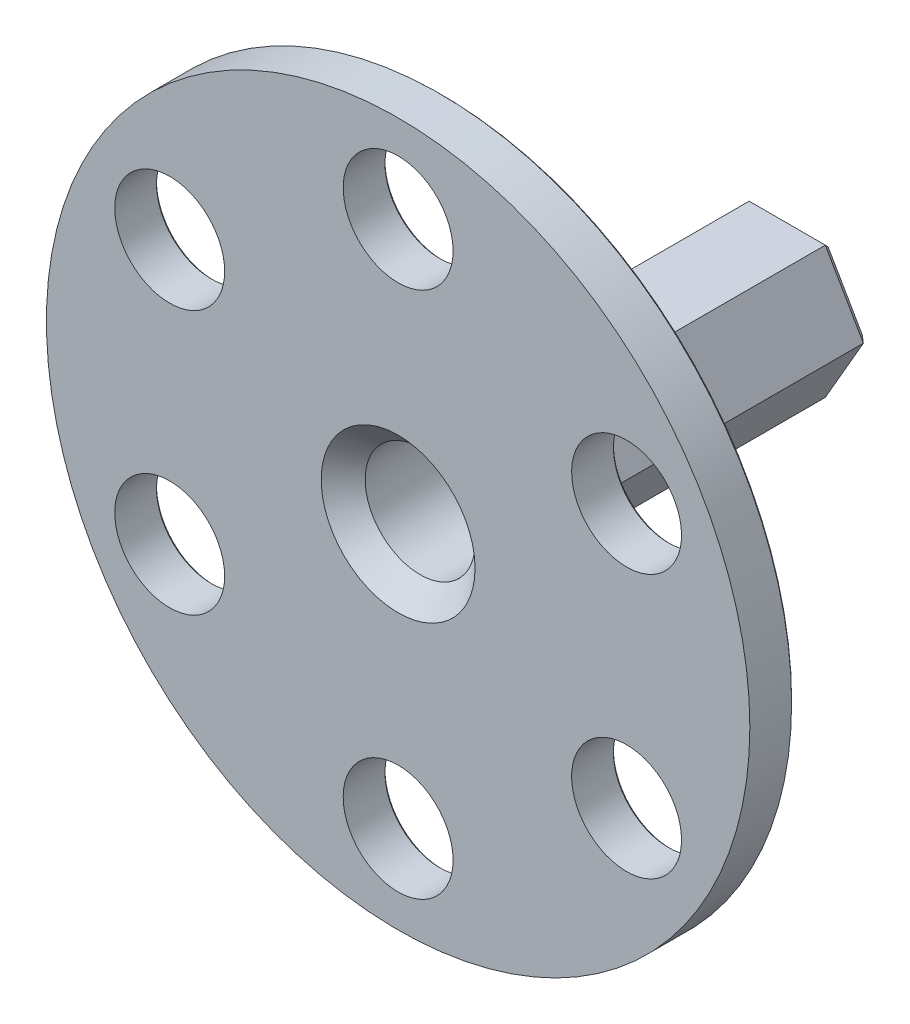
ISO-10303-21;
HEADER;
FILE_DESCRIPTION(('STEP AP214'),'2;1');
FILE_NAME('part.step','',(''),(''),'','','');
FILE_SCHEMA(('AUTOMOTIVE_DESIGN { 1 0 10303 214 1 1 1 1 }'));
ENDSEC;
DATA;
#1=APPLICATION_CONTEXT('core data for automotive mechanical design processes');
#2=APPLICATION_PROTOCOL_DEFINITION('international standard','automotive_design',2000,#1);
#3=PRODUCT_CONTEXT('',#1,'mechanical');
#4=PRODUCT('Part','Part','',(#3));
#5=PRODUCT_RELATED_PRODUCT_CATEGORY('part','',(#4));
#6=PRODUCT_DEFINITION_FORMATION('','',#4);
#7=PRODUCT_DEFINITION_CONTEXT('part definition',#1,'design');
#8=PRODUCT_DEFINITION('design','',#6,#7);
#9=PRODUCT_DEFINITION_SHAPE('','',#8);
#10=(LENGTH_UNIT() NAMED_UNIT(*) SI_UNIT(.MILLI.,.METRE.));
#11=(NAMED_UNIT(*) PLANE_ANGLE_UNIT() SI_UNIT($,.RADIAN.));
#12=(NAMED_UNIT(*) SI_UNIT($,.STERADIAN.) SOLID_ANGLE_UNIT());
#13=UNCERTAINTY_MEASURE_WITH_UNIT(LENGTH_MEASURE(1.E-05),#10,'distance_accuracy_value','');
#14=(GEOMETRIC_REPRESENTATION_CONTEXT(3) GLOBAL_UNCERTAINTY_ASSIGNED_CONTEXT((#13)) GLOBAL_UNIT_ASSIGNED_CONTEXT((#10,
#11,#12)) REPRESENTATION_CONTEXT('',''));
#15=CARTESIAN_POINT('',(0.,0.,0.));
#16=DIRECTION('',(0.,0.,1.));
#17=DIRECTION('',(1.,0.,0.));
#18=AXIS2_PLACEMENT_3D('',#15,#16,#17);
#19=CARTESIAN_POINT('',(0.,0.,-4.87838365161184));
#20=DIRECTION('',(0.,0.,1.));
#21=DIRECTION('',(1.,0.,0.));
#22=AXIS2_PLACEMENT_3D('',#19,#20,#21);
#23=PLANE('',#22);
#24=CARTESIAN_POINT('',(0.,-9.6,-4.87838365161184));
#25=DIRECTION('',(0.,0.,1.));
#26=DIRECTION('',(1.,0.,0.));
#27=AXIS2_PLACEMENT_3D('',#24,#25,#26);
#28=CIRCLE('',#27,2.08);
#29=CARTESIAN_POINT('',(2.08,-9.6,-4.87838365161184));
#30=VERTEX_POINT('',#29);
#31=EDGE_CURVE('E357',#30,#30,#28,.T.);
#32=ORIENTED_EDGE('',*,*,#31,.T.);
#33=EDGE_LOOP('',(#32));
#34=FACE_BOUND('',#33,.T.);
#35=CARTESIAN_POINT('',(8.31384387633059,-4.80000000000004,-4.87838365161184));
#36=DIRECTION('',(0.,0.,1.));
#37=DIRECTION('',(1.,0.,0.));
#38=AXIS2_PLACEMENT_3D('',#35,#36,#37);
#39=CIRCLE('',#38,2.08);
#40=CARTESIAN_POINT('',(10.3938438763306,-4.80000000000004,-4.87838365161184));
#41=VERTEX_POINT('',#40);
#42=EDGE_CURVE('E353',#41,#41,#39,.T.);
#43=ORIENTED_EDGE('',*,*,#42,.T.);
#44=EDGE_LOOP('',(#43));
#45=FACE_BOUND('',#44,.T.);
#46=CARTESIAN_POINT('',(8.31384387633062,4.79999999999998,-4.87838365161184));
#47=DIRECTION('',(0.,0.,1.));
#48=DIRECTION('',(1.,0.,0.));
#49=AXIS2_PLACEMENT_3D('',#46,#47,#48);
#50=CIRCLE('',#49,2.08);
#51=CARTESIAN_POINT('',(10.3938438763306,4.79999999999998,-4.87838365161184));
#52=VERTEX_POINT('',#51);
#53=EDGE_CURVE('E349',#52,#52,#50,.T.);
#54=ORIENTED_EDGE('',*,*,#53,.T.);
#55=EDGE_LOOP('',(#54));
#56=FACE_BOUND('',#55,.T.);
#57=CARTESIAN_POINT('',(0.,9.6,-4.87838365161184));
#58=DIRECTION('',(0.,0.,1.));
#59=DIRECTION('',(1.,0.,0.));
#60=AXIS2_PLACEMENT_3D('',#57,#58,#59);
#61=CIRCLE('',#60,2.08);
#62=CARTESIAN_POINT('',(2.08,9.6,-4.87838365161184));
#63=VERTEX_POINT('',#62);
#64=EDGE_CURVE('E345',#63,#63,#61,.T.);
#65=ORIENTED_EDGE('',*,*,#64,.T.);
#66=EDGE_LOOP('',(#65));
#67=FACE_BOUND('',#66,.T.);
#68=CARTESIAN_POINT('',(-8.31384387633056,4.80000000000009,-4.87838365161184));
#69=DIRECTION('',(0.,0.,1.));
#70=DIRECTION('',(1.,0.,0.));
#71=AXIS2_PLACEMENT_3D('',#68,#69,#70);
#72=CIRCLE('',#71,2.08000000000001);
#73=CARTESIAN_POINT('',(-6.23384387633055,4.80000000000009,-4.87838365161184));
#74=VERTEX_POINT('',#73);
#75=EDGE_CURVE('E341',#74,#74,#72,.T.);
#76=ORIENTED_EDGE('',*,*,#75,.T.);
#77=EDGE_LOOP('',(#76));
#78=FACE_BOUND('',#77,.T.);
#79=CARTESIAN_POINT('',(-8.31384387633065,-4.79999999999993,-4.87838365161184));
#80=DIRECTION('',(0.,0.,1.));
#81=DIRECTION('',(1.,0.,0.));
#82=AXIS2_PLACEMENT_3D('',#79,#80,#81);
#83=CIRCLE('',#82,2.08000000000001);
#84=CARTESIAN_POINT('',(-6.23384387633065,-4.79999999999993,-4.87838365161184));
#85=VERTEX_POINT('',#84);
#86=EDGE_CURVE('E337',#85,#85,#83,.T.);
#87=ORIENTED_EDGE('',*,*,#86,.T.);
#88=EDGE_LOOP('',(#87));
#89=FACE_BOUND('',#88,.T.);
#90=CARTESIAN_POINT('',(0.,0.,-4.87838365161184));
#91=DIRECTION('',(0.,0.,1.));
#92=DIRECTION('',(1.,0.,0.));
#93=AXIS2_PLACEMENT_3D('',#90,#91,#92);
#94=CIRCLE('',#93,12.72);
#95=CARTESIAN_POINT('',(12.72,0.,-4.87838365161184));
#96=VERTEX_POINT('',#95);
#97=EDGE_CURVE('E333',#96,#96,#94,.F.);
#98=ORIENTED_EDGE('',*,*,#97,.T.);
#99=EDGE_LOOP('',(#98));
#100=FACE_BOUND('',#99,.T.);
#101=DIRECTION('',(0.5,0.866025403784439,0.));
#102=VECTOR('',#101,1.);
#103=CARTESIAN_POINT('',(3.46410161513775,-0.399999999999999,-4.87838365161184));
#104=LINE('',#103,#102);
#105=CARTESIAN_POINT('',(1.8475208614068,-3.2,-4.87838365161184));
#106=VERTEX_POINT('',#105);
#107=CARTESIAN_POINT('',(3.6950417228136,0.,-4.87838365161184));
#108=VERTEX_POINT('',#107);
#109=EDGE_CURVE('E480',#106,#108,#104,.T.);
#110=ORIENTED_EDGE('',*,*,#109,.T.);
#111=DIRECTION('',(-0.5,0.866025403784439,0.));
#112=VECTOR('',#111,1.);
#113=CARTESIAN_POINT('',(2.07846096908265,2.8,-4.87838365161184));
#114=LINE('',#113,#112);
#115=CARTESIAN_POINT('',(1.8475208614068,3.19999999999999,-4.87838365161184));
#116=VERTEX_POINT('',#115);
#117=EDGE_CURVE('E483',#108,#116,#114,.T.);
#118=ORIENTED_EDGE('',*,*,#117,.T.);
#119=DIRECTION('',(-1.,0.,0.));
#120=VECTOR('',#119,1.);
#121=CARTESIAN_POINT('',(-1.3856406460551,3.19999999999999,-4.87838365161184));
#122=LINE('',#121,#120);
#123=CARTESIAN_POINT('',(-1.8475208614068,3.19999999999999,-4.87838365161184));
#124=VERTEX_POINT('',#123);
#125=EDGE_CURVE('E468',#116,#124,#122,.T.);
#126=ORIENTED_EDGE('',*,*,#125,.T.);
#127=DIRECTION('',(-0.5,-0.866025403784439,0.));
#128=VECTOR('',#127,1.);
#129=CARTESIAN_POINT('',(-3.46410161513775,0.399999999999996,-4.87838365161184));
#130=LINE('',#129,#128);
#131=CARTESIAN_POINT('',(-3.6950417228136,0.,-4.87838365161184));
#132=VERTEX_POINT('',#131);
#133=EDGE_CURVE('E471',#124,#132,#130,.T.);
#134=ORIENTED_EDGE('',*,*,#133,.T.);
#135=DIRECTION('',(0.5,-0.866025403784439,0.));
#136=VECTOR('',#135,1.);
#137=CARTESIAN_POINT('',(-2.07846096908265,-2.8,-4.87838365161184));
#138=LINE('',#137,#136);
#139=CARTESIAN_POINT('',(-1.8475208614068,-3.2,-4.87838365161184));
#140=VERTEX_POINT('',#139);
#141=EDGE_CURVE('E474',#132,#140,#138,.T.);
#142=ORIENTED_EDGE('',*,*,#141,.T.);
#143=DIRECTION('',(1.,0.,0.));
#144=VECTOR('',#143,1.);
#145=CARTESIAN_POINT('',(1.38564064605511,-3.2,-4.87838365161184));
#146=LINE('',#145,#144);
#147=EDGE_CURVE('E477',#140,#106,#146,.T.);
#148=ORIENTED_EDGE('',*,*,#147,.T.);
#149=EDGE_LOOP('',(#110,#118,#126,#134,#142,#148));
#150=FACE_BOUND('',#149,.T.);
#151=ADVANCED_FACE('F50',(#34,#45,#56,#67,#78,#89,#100,#150),#23,.F.);
#152=CARTESIAN_POINT('',(0.,0.,-4.87838365161184));
#153=DIRECTION('',(0.,0.,1.));
#154=DIRECTION('',(1.,0.,0.));
#155=AXIS2_PLACEMENT_3D('',#152,#153,#154);
#156=CYLINDRICAL_SURFACE('',#155,12.8);
#157=CARTESIAN_POINT('',(0.,0.,-4.79838365161185));
#158=DIRECTION('',(0.,0.,1.));
#159=DIRECTION('',(1.,0.,0.));
#160=AXIS2_PLACEMENT_3D('',#157,#158,#159);
#161=CIRCLE('',#160,12.8);
#162=CARTESIAN_POINT('',(12.8,0.,-4.79838365161185));
#163=VERTEX_POINT('',#162);
#164=EDGE_CURVE('E384',#163,#163,#161,.T.);
#165=ORIENTED_EDGE('',*,*,#164,.T.);
#166=EDGE_LOOP('',(#165));
#167=FACE_BOUND('',#166,.T.);
#168=CARTESIAN_POINT('',(0.,0.,-3.27838365161185));
#169=DIRECTION('',(0.,0.,1.));
#170=DIRECTION('',(1.,0.,0.));
#171=AXIS2_PLACEMENT_3D('',#168,#169,#170);
#172=CIRCLE('',#171,12.8);
#173=CARTESIAN_POINT('',(12.8,0.,-3.27838365161185));
#174=VERTEX_POINT('',#173);
#175=EDGE_CURVE('E460',#174,#174,#172,.T.);
#176=ORIENTED_EDGE('',*,*,#175,.F.);
#177=EDGE_LOOP('',(#176));
#178=FACE_BOUND('',#177,.T.);
#179=ADVANCED_FACE('F157',(#167,#178),#156,.T.);
#180=CARTESIAN_POINT('',(0.,0.,-3.27838365161185));
#181=DIRECTION('',(0.,0.,1.));
#182=DIRECTION('',(1.,0.,0.));
#183=AXIS2_PLACEMENT_3D('',#180,#181,#182);
#184=PLANE('',#183);
#185=CARTESIAN_POINT('',(0.,0.,-3.27838365161185));
#186=DIRECTION('',(0.,0.,1.));
#187=DIRECTION('',(1.,0.,0.));
#188=AXIS2_PLACEMENT_3D('',#185,#186,#187);
#189=CIRCLE('',#188,2.80000000000001);
#190=CARTESIAN_POINT('',(2.80000000000002,0.,-3.27838365161185));
#191=VERTEX_POINT('',#190);
#192=EDGE_CURVE('E11',#191,#191,#189,.F.);
#193=ORIENTED_EDGE('',*,*,#192,.T.);
#194=EDGE_LOOP('',(#193));
#195=FACE_BOUND('',#194,.T.);
#196=CARTESIAN_POINT('',(-8.31384387633056,4.80000000000009,-3.27838365161185));
#197=DIRECTION('',(0.,0.,1.));
#198=DIRECTION('',(0.50000000000001,0.866025403784433,0.));
#199=AXIS2_PLACEMENT_3D('',#196,#197,#198);
#200=CIRCLE('',#199,2.);
#201=CARTESIAN_POINT('',(-7.31384387633053,6.53205080756896,-3.27838365161185));
#202=VERTEX_POINT('',#201);
#203=EDGE_CURVE('E436',#202,#202,#200,.T.);
#204=ORIENTED_EDGE('',*,*,#203,.F.);
#205=EDGE_LOOP('',(#204));
#206=FACE_BOUND('',#205,.T.);
#207=CARTESIAN_POINT('',(-8.31384387633065,-4.79999999999993,-3.27838365161185));
#208=DIRECTION('',(0.,0.,1.));
#209=DIRECTION('',(-0.499999999999992,0.866025403784443,0.));
#210=AXIS2_PLACEMENT_3D('',#207,#208,#209);
#211=CIRCLE('',#210,2.);
#212=CARTESIAN_POINT('',(-9.31384387633064,-3.06794919243104,-3.27838365161185));
#213=VERTEX_POINT('',#212);
#214=EDGE_CURVE('E446',#213,#213,#211,.T.);
#215=ORIENTED_EDGE('',*,*,#214,.F.);
#216=EDGE_LOOP('',(#215));
#217=FACE_BOUND('',#216,.T.);
#218=CARTESIAN_POINT('',(0.,-9.6,-3.27838365161185));
#219=DIRECTION('',(0.,0.,1.));
#220=DIRECTION('',(-1.,0.,0.));
#221=AXIS2_PLACEMENT_3D('',#218,#219,#220);
#222=CIRCLE('',#221,2.);
#223=CARTESIAN_POINT('',(-2.,-9.6,-3.27838365161185));
#224=VERTEX_POINT('',#223);
#225=EDGE_CURVE('E442',#224,#224,#222,.T.);
#226=ORIENTED_EDGE('',*,*,#225,.F.);
#227=EDGE_LOOP('',(#226));
#228=FACE_BOUND('',#227,.T.);
#229=CARTESIAN_POINT('',(8.31384387633059,-4.80000000000004,-3.27838365161185));
#230=DIRECTION('',(0.,0.,1.));
#231=DIRECTION('',(-0.500000000000004,-0.866025403784436,0.));
#232=AXIS2_PLACEMENT_3D('',#229,#230,#231);
#233=CIRCLE('',#232,2.);
#234=CARTESIAN_POINT('',(7.31384387633058,-6.53205080756892,-3.27838365161185));
#235=VERTEX_POINT('',#234);
#236=EDGE_CURVE('E437',#235,#235,#233,.T.);
#237=ORIENTED_EDGE('',*,*,#236,.F.);
#238=EDGE_LOOP('',(#237));
#239=FACE_BOUND('',#238,.T.);
#240=CARTESIAN_POINT('',(8.31384387633062,4.79999999999998,-3.27838365161185));
#241=DIRECTION('',(0.,0.,1.));
#242=DIRECTION('',(0.499999999999998,-0.86602540378444,0.));
#243=AXIS2_PLACEMENT_3D('',#240,#241,#242);
#244=CIRCLE('',#243,2.);
#245=CARTESIAN_POINT('',(9.31384387633062,3.0679491924311,-3.27838365161185));
#246=VERTEX_POINT('',#245);
#247=EDGE_CURVE('E441',#246,#246,#244,.T.);
#248=ORIENTED_EDGE('',*,*,#247,.F.);
#249=EDGE_LOOP('',(#248));
#250=FACE_BOUND('',#249,.T.);
#251=CARTESIAN_POINT('',(0.,9.6,-3.27838365161185));
#252=DIRECTION('',(0.,0.,1.));
#253=DIRECTION('',(1.,0.,0.));
#254=AXIS2_PLACEMENT_3D('',#251,#252,#253);
#255=CIRCLE('',#254,2.);
#256=CARTESIAN_POINT('',(2.,9.6,-3.27838365161185));
#257=VERTEX_POINT('',#256);
#258=EDGE_CURVE('E456',#257,#257,#255,.T.);
#259=ORIENTED_EDGE('',*,*,#258,.F.);
#260=EDGE_LOOP('',(#259));
#261=FACE_BOUND('',#260,.T.);
#262=ORIENTED_EDGE('',*,*,#175,.T.);
#263=EDGE_LOOP('',(#262));
#264=FACE_BOUND('',#263,.T.);
#265=ADVANCED_FACE('F163',(#195,#206,#217,#228,#239,#250,#261,#264),#184,.T.);
#266=CARTESIAN_POINT('',(0.,9.6,-4.87838365161184));
#267=DIRECTION('',(0.,0.,1.));
#268=DIRECTION('',(1.,0.,0.));
#269=AXIS2_PLACEMENT_3D('',#266,#267,#268);
#270=CYLINDRICAL_SURFACE('',#269,2.);
#271=CARTESIAN_POINT('',(0.,9.6,-4.79838365161185));
#272=DIRECTION('',(0.,0.,1.));
#273=DIRECTION('',(1.,0.,0.));
#274=AXIS2_PLACEMENT_3D('',#271,#272,#273);
#275=CIRCLE('',#274,2.);
#276=CARTESIAN_POINT('',(2.,9.6,-4.79838365161185));
#277=VERTEX_POINT('',#276);
#278=EDGE_CURVE('E372',#277,#277,#275,.F.);
#279=ORIENTED_EDGE('',*,*,#278,.T.);
#280=EDGE_LOOP('',(#279));
#281=FACE_BOUND('',#280,.T.);
#282=ORIENTED_EDGE('',*,*,#258,.T.);
#283=EDGE_LOOP('',(#282));
#284=FACE_BOUND('',#283,.T.);
#285=ADVANCED_FACE('F170',(#281,#284),#270,.F.);
#286=CARTESIAN_POINT('',(8.31384387633062,4.79999999999998,-4.87838365161184));
#287=DIRECTION('',(0.,0.,1.));
#288=DIRECTION('',(1.,0.,0.));
#289=AXIS2_PLACEMENT_3D('',#286,#287,#288);
#290=CYLINDRICAL_SURFACE('',#289,2.);
#291=CARTESIAN_POINT('',(8.31384387633062,4.79999999999998,-4.79838365161185));
#292=DIRECTION('',(0.,0.,1.));
#293=DIRECTION('',(1.,0.,0.));
#294=AXIS2_PLACEMENT_3D('',#291,#292,#293);
#295=CIRCLE('',#294,2.);
#296=CARTESIAN_POINT('',(10.3138438763306,4.79999999999998,-4.79838365161185));
#297=VERTEX_POINT('',#296);
#298=EDGE_CURVE('E368',#297,#297,#295,.F.);
#299=ORIENTED_EDGE('',*,*,#298,.T.);
#300=EDGE_LOOP('',(#299));
#301=FACE_BOUND('',#300,.T.);
#302=ORIENTED_EDGE('',*,*,#247,.T.);
#303=EDGE_LOOP('',(#302));
#304=FACE_BOUND('',#303,.T.);
#305=ADVANCED_FACE('F525',(#301,#304),#290,.F.);
#306=CARTESIAN_POINT('',(8.31384387633059,-4.80000000000004,-4.87838365161184));
#307=DIRECTION('',(0.,0.,1.));
#308=DIRECTION('',(1.,0.,0.));
#309=AXIS2_PLACEMENT_3D('',#306,#307,#308);
#310=CYLINDRICAL_SURFACE('',#309,2.);
#311=CARTESIAN_POINT('',(8.31384387633059,-4.80000000000004,-4.79838365161184));
#312=DIRECTION('',(0.,0.,1.));
#313=DIRECTION('',(1.,0.,0.));
#314=AXIS2_PLACEMENT_3D('',#311,#312,#313);
#315=CIRCLE('',#314,2.);
#316=CARTESIAN_POINT('',(10.3138438763306,-4.80000000000004,-4.79838365161184));
#317=VERTEX_POINT('',#316);
#318=EDGE_CURVE('E364',#317,#317,#315,.F.);
#319=ORIENTED_EDGE('',*,*,#318,.T.);
#320=EDGE_LOOP('',(#319));
#321=FACE_BOUND('',#320,.T.);
#322=ORIENTED_EDGE('',*,*,#236,.T.);
#323=EDGE_LOOP('',(#322));
#324=FACE_BOUND('',#323,.T.);
#325=ADVANCED_FACE('F521',(#321,#324),#310,.F.);
#326=CARTESIAN_POINT('',(0.,-9.6,-4.87838365161184));
#327=DIRECTION('',(0.,0.,1.));
#328=DIRECTION('',(1.,0.,0.));
#329=AXIS2_PLACEMENT_3D('',#326,#327,#328);
#330=CYLINDRICAL_SURFACE('',#329,2.);
#331=CARTESIAN_POINT('',(0.,-9.6,-4.79838365161185));
#332=DIRECTION('',(0.,0.,1.));
#333=DIRECTION('',(1.,0.,0.));
#334=AXIS2_PLACEMENT_3D('',#331,#332,#333);
#335=CIRCLE('',#334,2.);
#336=CARTESIAN_POINT('',(2.,-9.6,-4.79838365161185));
#337=VERTEX_POINT('',#336);
#338=EDGE_CURVE('E360',#337,#337,#335,.F.);
#339=ORIENTED_EDGE('',*,*,#338,.T.);
#340=EDGE_LOOP('',(#339));
#341=FACE_BOUND('',#340,.T.);
#342=ORIENTED_EDGE('',*,*,#225,.T.);
#343=EDGE_LOOP('',(#342));
#344=FACE_BOUND('',#343,.T.);
#345=ADVANCED_FACE('F524',(#341,#344),#330,.F.);
#346=CARTESIAN_POINT('',(-8.31384387633065,-4.79999999999993,-4.87838365161184));
#347=DIRECTION('',(0.,0.,1.));
#348=DIRECTION('',(1.,0.,0.));
#349=AXIS2_PLACEMENT_3D('',#346,#347,#348);
#350=CYLINDRICAL_SURFACE('',#349,2.);
#351=CARTESIAN_POINT('',(-8.31384387633065,-4.79999999999993,-4.79838365161184));
#352=DIRECTION('',(0.,0.,1.));
#353=DIRECTION('',(1.,0.,0.));
#354=AXIS2_PLACEMENT_3D('',#351,#352,#353);
#355=CIRCLE('',#354,2.);
#356=CARTESIAN_POINT('',(-6.31384387633065,-4.79999999999993,-4.79838365161184));
#357=VERTEX_POINT('',#356);
#358=EDGE_CURVE('E380',#357,#357,#355,.F.);
#359=ORIENTED_EDGE('',*,*,#358,.T.);
#360=EDGE_LOOP('',(#359));
#361=FACE_BOUND('',#360,.T.);
#362=ORIENTED_EDGE('',*,*,#214,.T.);
#363=EDGE_LOOP('',(#362));
#364=FACE_BOUND('',#363,.T.);
#365=ADVANCED_FACE('F529',(#361,#364),#350,.F.);
#366=CARTESIAN_POINT('',(-8.31384387633056,4.80000000000009,-4.87838365161184));
#367=DIRECTION('',(0.,0.,1.));
#368=DIRECTION('',(1.,0.,0.));
#369=AXIS2_PLACEMENT_3D('',#366,#367,#368);
#370=CYLINDRICAL_SURFACE('',#369,2.);
#371=CARTESIAN_POINT('',(-8.31384387633056,4.80000000000009,-4.79838365161184));
#372=DIRECTION('',(0.,0.,1.));
#373=DIRECTION('',(1.,0.,0.));
#374=AXIS2_PLACEMENT_3D('',#371,#372,#373);
#375=CIRCLE('',#374,2.);
#376=CARTESIAN_POINT('',(-6.31384387633055,4.80000000000009,-4.79838365161184));
#377=VERTEX_POINT('',#376);
#378=EDGE_CURVE('E376',#377,#377,#375,.F.);
#379=ORIENTED_EDGE('',*,*,#378,.T.);
#380=EDGE_LOOP('',(#379));
#381=FACE_BOUND('',#380,.T.);
#382=ORIENTED_EDGE('',*,*,#203,.T.);
#383=EDGE_LOOP('',(#382));
#384=FACE_BOUND('',#383,.T.);
#385=ADVANCED_FACE('F517',(#381,#384),#370,.F.);
#386=CARTESIAN_POINT('',(-1.3856406460551,2.4,-17.6783836516118));
#387=DIRECTION('',(0.,-1.,0.));
#388=DIRECTION('',(1.,0.,0.));
#389=AXIS2_PLACEMENT_3D('',#386,#387,#388);
#390=PLANE('',#389);
#391=DIRECTION('',(0.,0.,1.));
#392=VECTOR('',#391,1.);
#393=CARTESIAN_POINT('',(1.3856406460551,2.4,-17.6783836516118));
#394=LINE('',#393,#392);
#395=CARTESIAN_POINT('',(1.3856406460551,2.4,-17.4383836516118));
#396=VERTEX_POINT('',#395);
#397=CARTESIAN_POINT('',(1.3856406460551,2.4,-5.67838365161185));
#398=VERTEX_POINT('',#397);
#399=EDGE_CURVE('E428',#396,#398,#394,.T.);
#400=ORIENTED_EDGE('',*,*,#399,.F.);
#401=DIRECTION('',(-1.,0.,0.));
#402=VECTOR('',#401,1.);
#403=CARTESIAN_POINT('',(-1.3856406460551,2.4,-17.4383836516118));
#404=LINE('',#403,#402);
#405=CARTESIAN_POINT('',(-1.3856406460551,2.4,-17.4383836516118));
#406=VERTEX_POINT('',#405);
#407=EDGE_CURVE('E270',#396,#406,#404,.T.);
#408=ORIENTED_EDGE('',*,*,#407,.T.);
#409=DIRECTION('',(0.,0.,1.));
#410=VECTOR('',#409,1.);
#411=CARTESIAN_POINT('',(-1.3856406460551,2.4,-17.6783836516118));
#412=LINE('',#411,#410);
#413=CARTESIAN_POINT('',(-1.3856406460551,2.4,-5.67838365161185));
#414=VERTEX_POINT('',#413);
#415=EDGE_CURVE('E332',#406,#414,#412,.T.);
#416=ORIENTED_EDGE('',*,*,#415,.T.);
#417=DIRECTION('',(1.,0.,0.));
#418=VECTOR('',#417,1.);
#419=CARTESIAN_POINT('',(1.3856406460551,2.4,-5.67838365161185));
#420=LINE('',#419,#418);
#421=EDGE_CURVE('E314',#414,#398,#420,.T.);
#422=ORIENTED_EDGE('',*,*,#421,.T.);
#423=EDGE_LOOP('',(#400,#408,#416,#422));
#424=FACE_BOUND('',#423,.T.);
#425=ADVANCED_FACE('F507',(#424),#390,.F.);
#426=CARTESIAN_POINT('',(1.3856406460551,2.4,-17.6783836516118));
#427=DIRECTION('',(-0.866025403784439,-0.5,0.));
#428=DIRECTION('',(0.5,-0.866025403784439,0.));
#429=AXIS2_PLACEMENT_3D('',#426,#427,#428);
#430=PLANE('',#429);
#431=DIRECTION('',(0.,0.,1.));
#432=VECTOR('',#431,1.);
#433=CARTESIAN_POINT('',(2.77128129211021,0.,-17.6783836516118));
#434=LINE('',#433,#432);
#435=CARTESIAN_POINT('',(2.77128129211021,0.,-17.4383836516118));
#436=VERTEX_POINT('',#435);
#437=CARTESIAN_POINT('',(2.77128129211021,0.,-5.67838365161185));
#438=VERTEX_POINT('',#437);
#439=EDGE_CURVE('E138',#436,#438,#434,.T.);
#440=ORIENTED_EDGE('',*,*,#439,.F.);
#441=DIRECTION('',(-0.5,0.866025403784439,0.));
#442=VECTOR('',#441,1.);
#443=CARTESIAN_POINT('',(1.3856406460551,2.4,-17.4383836516118));
#444=LINE('',#443,#442);
#445=EDGE_CURVE('E67',#436,#396,#444,.T.);
#446=ORIENTED_EDGE('',*,*,#445,.T.);
#447=ORIENTED_EDGE('',*,*,#399,.T.);
#448=DIRECTION('',(0.5,-0.866025403784439,0.));
#449=VECTOR('',#448,1.);
#450=CARTESIAN_POINT('',(2.77128129211021,0.,-5.67838365161185));
#451=LINE('',#450,#449);
#452=EDGE_CURVE('E464',#398,#438,#451,.T.);
#453=ORIENTED_EDGE('',*,*,#452,.T.);
#454=EDGE_LOOP('',(#440,#446,#447,#453));
#455=FACE_BOUND('',#454,.T.);
#456=ADVANCED_FACE('F509',(#455),#430,.F.);
#457=CARTESIAN_POINT('',(2.77128129211021,0.,-17.6783836516118));
#458=DIRECTION('',(-0.866025403784439,0.5,0.));
#459=DIRECTION('',(-0.5,-0.866025403784439,0.));
#460=AXIS2_PLACEMENT_3D('',#457,#458,#459);
#461=PLANE('',#460);
#462=DIRECTION('',(0.,0.,1.));
#463=VECTOR('',#462,1.);
#464=CARTESIAN_POINT('',(1.38564064605511,-2.4,-17.6783836516118));
#465=LINE('',#464,#463);
#466=CARTESIAN_POINT('',(1.38564064605511,-2.4,-17.4383836516118));
#467=VERTEX_POINT('',#466);
#468=CARTESIAN_POINT('',(1.38564064605511,-2.4,-5.67838365161185));
#469=VERTEX_POINT('',#468);
#470=EDGE_CURVE('E418',#467,#469,#465,.T.);
#471=ORIENTED_EDGE('',*,*,#470,.F.);
#472=DIRECTION('',(0.5,0.866025403784439,0.));
#473=VECTOR('',#472,1.);
#474=CARTESIAN_POINT('',(2.77128129211021,0.,-17.4383836516118));
#475=LINE('',#474,#473);
#476=EDGE_CURVE('E257',#467,#436,#475,.T.);
#477=ORIENTED_EDGE('',*,*,#476,.T.);
#478=ORIENTED_EDGE('',*,*,#439,.T.);
#479=DIRECTION('',(-0.5,-0.866025403784439,0.));
#480=VECTOR('',#479,1.);
#481=CARTESIAN_POINT('',(1.38564064605511,-2.4,-5.67838365161185));
#482=LINE('',#481,#480);
#483=EDGE_CURVE('E422',#438,#469,#482,.T.);
#484=ORIENTED_EDGE('',*,*,#483,.T.);
#485=EDGE_LOOP('',(#471,#477,#478,#484));
#486=FACE_BOUND('',#485,.T.);
#487=ADVANCED_FACE('F421',(#486),#461,.F.);
#488=CARTESIAN_POINT('',(1.38564064605511,-2.4,-17.6783836516118));
#489=DIRECTION('',(0.,1.,0.));
#490=DIRECTION('',(-1.,0.,0.));
#491=AXIS2_PLACEMENT_3D('',#488,#489,#490);
#492=PLANE('',#491);
#493=DIRECTION('',(0.,0.,1.));
#494=VECTOR('',#493,1.);
#495=CARTESIAN_POINT('',(-1.3856406460551,-2.4,-17.6783836516118));
#496=LINE('',#495,#494);
#497=CARTESIAN_POINT('',(-1.3856406460551,-2.4,-17.4383836516118));
#498=VERTEX_POINT('',#497);
#499=CARTESIAN_POINT('',(-1.3856406460551,-2.4,-5.67838365161185));
#500=VERTEX_POINT('',#499);
#501=EDGE_CURVE('E419',#498,#500,#496,.T.);
#502=ORIENTED_EDGE('',*,*,#501,.F.);
#503=DIRECTION('',(1.,0.,0.));
#504=VECTOR('',#503,1.);
#505=CARTESIAN_POINT('',(1.38564064605511,-2.4,-17.4383836516118));
#506=LINE('',#505,#504);
#507=EDGE_CURVE('E276',#498,#467,#506,.T.);
#508=ORIENTED_EDGE('',*,*,#507,.T.);
#509=ORIENTED_EDGE('',*,*,#470,.T.);
#510=DIRECTION('',(-1.,0.,0.));
#511=VECTOR('',#510,1.);
#512=CARTESIAN_POINT('',(-1.3856406460551,-2.4,-5.67838365161185));
#513=LINE('',#512,#511);
#514=EDGE_CURVE('E489',#469,#500,#513,.T.);
#515=ORIENTED_EDGE('',*,*,#514,.T.);
#516=EDGE_LOOP('',(#502,#508,#509,#515));
#517=FACE_BOUND('',#516,.T.);
#518=ADVANCED_FACE('F416',(#517),#492,.F.);
#519=CARTESIAN_POINT('',(-1.3856406460551,-2.4,-17.6783836516118));
#520=DIRECTION('',(0.866025403784439,0.5,0.));
#521=DIRECTION('',(-0.5,0.866025403784439,0.));
#522=AXIS2_PLACEMENT_3D('',#519,#520,#521);
#523=PLANE('',#522);
#524=DIRECTION('',(0.,0.,1.));
#525=VECTOR('',#524,1.);
#526=CARTESIAN_POINT('',(-2.7712812921102,0.,-17.6783836516118));
#527=LINE('',#526,#525);
#528=CARTESIAN_POINT('',(-2.7712812921102,0.,-17.4383836516118));
#529=VERTEX_POINT('',#528);
#530=CARTESIAN_POINT('',(-2.7712812921102,0.,-5.67838365161185));
#531=VERTEX_POINT('',#530);
#532=EDGE_CURVE('E430',#529,#531,#527,.T.);
#533=ORIENTED_EDGE('',*,*,#532,.F.);
#534=DIRECTION('',(0.5,-0.866025403784439,0.));
#535=VECTOR('',#534,1.);
#536=CARTESIAN_POINT('',(-1.3856406460551,-2.4,-17.4383836516118));
#537=LINE('',#536,#535);
#538=EDGE_CURVE('E410',#529,#498,#537,.T.);
#539=ORIENTED_EDGE('',*,*,#538,.T.);
#540=ORIENTED_EDGE('',*,*,#501,.T.);
#541=DIRECTION('',(-0.5,0.866025403784439,0.));
#542=VECTOR('',#541,1.);
#543=CARTESIAN_POINT('',(-2.7712812921102,0.,-5.67838365161185));
#544=LINE('',#543,#542);
#545=EDGE_CURVE('E492',#500,#531,#544,.T.);
#546=ORIENTED_EDGE('',*,*,#545,.T.);
#547=EDGE_LOOP('',(#533,#539,#540,#546));
#548=FACE_BOUND('',#547,.T.);
#549=ADVANCED_FACE('F573',(#548),#523,.F.);
#550=CARTESIAN_POINT('',(-2.7712812921102,0.,-17.6783836516118));
#551=DIRECTION('',(0.866025403784439,-0.5,0.));
#552=DIRECTION('',(0.5,0.866025403784439,0.));
#553=AXIS2_PLACEMENT_3D('',#550,#551,#552);
#554=PLANE('',#553);
#555=ORIENTED_EDGE('',*,*,#415,.F.);
#556=DIRECTION('',(-0.5,-0.866025403784439,0.));
#557=VECTOR('',#556,1.);
#558=CARTESIAN_POINT('',(-2.7712812921102,0.,-17.4383836516118));
#559=LINE('',#558,#557);
#560=EDGE_CURVE('E406',#406,#529,#559,.T.);
#561=ORIENTED_EDGE('',*,*,#560,.T.);
#562=ORIENTED_EDGE('',*,*,#532,.T.);
#563=DIRECTION('',(0.5,0.866025403784439,0.));
#564=VECTOR('',#563,1.);
#565=CARTESIAN_POINT('',(-1.3856406460551,2.4,-5.67838365161185));
#566=LINE('',#565,#564);
#567=EDGE_CURVE('E495',#531,#414,#566,.T.);
#568=ORIENTED_EDGE('',*,*,#567,.T.);
#569=EDGE_LOOP('',(#555,#561,#562,#568));
#570=FACE_BOUND('',#569,.T.);
#571=ADVANCED_FACE('F579',(#570),#554,.F.);
#572=CARTESIAN_POINT('',(0.,0.,-17.6783836516118));
#573=DIRECTION('',(0.,0.,-1.));
#574=DIRECTION('',(-1.,0.,0.));
#575=AXIS2_PLACEMENT_3D('',#572,#573,#574);
#576=PLANE('',#575);
#577=DIRECTION('',(-0.5,0.866025403784439,0.));
#578=VECTOR('',#577,1.);
#579=CARTESIAN_POINT('',(-2.56343519520193,0.12,-17.6783836516118));
#580=LINE('',#579,#578);
#581=CARTESIAN_POINT('',(-1.24707658144959,-2.16,-17.6783836516118));
#582=VERTEX_POINT('',#581);
#583=CARTESIAN_POINT('',(-2.49415316289918,0.,-17.6783836516118));
#584=VERTEX_POINT('',#583);
#585=EDGE_CURVE('E399',#582,#584,#580,.T.);
#586=ORIENTED_EDGE('',*,*,#585,.T.);
#587=DIRECTION('',(0.5,0.866025403784439,0.));
#588=VECTOR('',#587,1.);
#589=CARTESIAN_POINT('',(-1.17779454914683,2.28,-17.6783836516118));
#590=LINE('',#589,#588);
#591=CARTESIAN_POINT('',(-1.24707658144959,2.16,-17.6783836516118));
#592=VERTEX_POINT('',#591);
#593=EDGE_CURVE('E402',#584,#592,#590,.T.);
#594=ORIENTED_EDGE('',*,*,#593,.T.);
#595=DIRECTION('',(1.,0.,0.));
#596=VECTOR('',#595,1.);
#597=CARTESIAN_POINT('',(1.3856406460551,2.16,-17.6783836516118));
#598=LINE('',#597,#596);
#599=CARTESIAN_POINT('',(1.24707658144959,2.16,-17.6783836516118));
#600=VERTEX_POINT('',#599);
#601=EDGE_CURVE('E388',#592,#600,#598,.T.);
#602=ORIENTED_EDGE('',*,*,#601,.T.);
#603=DIRECTION('',(0.5,-0.866025403784439,0.));
#604=VECTOR('',#603,1.);
#605=CARTESIAN_POINT('',(2.56343519520194,-0.120000000000002,-17.6783836516118));
#606=LINE('',#605,#604);
#607=CARTESIAN_POINT('',(2.49415316289918,0.,-17.6783836516118));
#608=VERTEX_POINT('',#607);
#609=EDGE_CURVE('E391',#600,#608,#606,.T.);
#610=ORIENTED_EDGE('',*,*,#609,.T.);
#611=DIRECTION('',(-0.5,-0.866025403784439,0.));
#612=VECTOR('',#611,1.);
#613=CARTESIAN_POINT('',(1.17779454914684,-2.28,-17.6783836516118));
#614=LINE('',#613,#612);
#615=CARTESIAN_POINT('',(1.24707658144959,-2.16,-17.6783836516118));
#616=VERTEX_POINT('',#615);
#617=EDGE_CURVE('E259',#608,#616,#614,.T.);
#618=ORIENTED_EDGE('',*,*,#617,.T.);
#619=DIRECTION('',(-1.,0.,0.));
#620=VECTOR('',#619,1.);
#621=CARTESIAN_POINT('',(-1.3856406460551,-2.16,-17.6783836516118));
#622=LINE('',#621,#620);
#623=EDGE_CURVE('E396',#616,#582,#622,.T.);
#624=ORIENTED_EDGE('',*,*,#623,.T.);
#625=EDGE_LOOP('',(#586,#594,#602,#610,#618,#624));
#626=FACE_BOUND('',#625,.T.);
#627=ADVANCED_FACE('F199',(#626),#576,.T.);
#628=CARTESIAN_POINT('',(-1.3856406460551,-2.4,-5.67838365161185));
#629=DIRECTION('',(-0.612372435695796,-0.353553390593275,-0.707106781186545));
#630=DIRECTION('',(0.5,-0.866025403784439,0.));
#631=AXIS2_PLACEMENT_3D('',#628,#629,#630);
#632=PLANE('',#631);
#633=DIRECTION('',(-0.377964473009227,-0.654653670707975,0.65465367070798));
#634=VECTOR('',#633,1.);
#635=CARTESIAN_POINT('',(-1.3856406460551,-2.4,-5.67838365161185));
#636=LINE('',#635,#634);
#637=EDGE_CURVE('E324',#140,#500,#636,.F.);
#638=ORIENTED_EDGE('',*,*,#637,.F.);
#639=ORIENTED_EDGE('',*,*,#141,.F.);
#640=DIRECTION('',(-0.755928946018452,0.,0.65465367070798));
#641=VECTOR('',#640,1.);
#642=CARTESIAN_POINT('',(-2.7712812921102,0.,-5.67838365161185));
#643=LINE('',#642,#641);
#644=EDGE_CURVE('E328',#531,#132,#643,.T.);
#645=ORIENTED_EDGE('',*,*,#644,.F.);
#646=ORIENTED_EDGE('',*,*,#545,.F.);
#647=EDGE_LOOP('',(#638,#639,#645,#646));
#648=FACE_BOUND('',#647,.T.);
#649=ADVANCED_FACE('F195',(#648),#632,.T.);
#650=CARTESIAN_POINT('',(-2.7712812921102,0.,-5.67838365161185));
#651=DIRECTION('',(-0.612372435695797,0.353553390593275,-0.707106781186545));
#652=DIRECTION('',(-0.5,-0.866025403784439,0.));
#653=AXIS2_PLACEMENT_3D('',#650,#651,#652);
#654=PLANE('',#653);
#655=ORIENTED_EDGE('',*,*,#644,.T.);
#656=ORIENTED_EDGE('',*,*,#133,.F.);
#657=DIRECTION('',(-0.377964473009226,0.654653670707975,0.65465367070798));
#658=VECTOR('',#657,1.);
#659=CARTESIAN_POINT('',(-1.3856406460551,2.4,-5.67838365161185));
#660=LINE('',#659,#658);
#661=EDGE_CURVE('E320',#414,#124,#660,.T.);
#662=ORIENTED_EDGE('',*,*,#661,.F.);
#663=ORIENTED_EDGE('',*,*,#567,.F.);
#664=EDGE_LOOP('',(#655,#656,#662,#663));
#665=FACE_BOUND('',#664,.T.);
#666=ADVANCED_FACE('F191',(#665),#654,.T.);
#667=CARTESIAN_POINT('',(1.38564064605511,-2.4,-5.67838365161185));
#668=DIRECTION('',(0.,-0.70710678118655,-0.707106781186545));
#669=DIRECTION('',(1.,0.,0.));
#670=AXIS2_PLACEMENT_3D('',#667,#668,#669);
#671=PLANE('',#670);
#672=ORIENTED_EDGE('',*,*,#637,.T.);
#673=ORIENTED_EDGE('',*,*,#514,.F.);
#674=DIRECTION('',(0.377964473009226,-0.654653670707975,0.65465367070798));
#675=VECTOR('',#674,1.);
#676=CARTESIAN_POINT('',(1.38564064605511,-2.4,-5.67838365161185));
#677=LINE('',#676,#675);
#678=EDGE_CURVE('E311',#106,#469,#677,.F.);
#679=ORIENTED_EDGE('',*,*,#678,.F.);
#680=ORIENTED_EDGE('',*,*,#147,.F.);
#681=EDGE_LOOP('',(#672,#673,#679,#680));
#682=FACE_BOUND('',#681,.T.);
#683=ADVANCED_FACE('F187',(#682),#671,.T.);
#684=CARTESIAN_POINT('',(-1.3856406460551,2.4,-5.67838365161185));
#685=DIRECTION('',(0.,0.70710678118655,-0.707106781186545));
#686=DIRECTION('',(-1.,0.,0.));
#687=AXIS2_PLACEMENT_3D('',#684,#685,#686);
#688=PLANE('',#687);
#689=ORIENTED_EDGE('',*,*,#661,.T.);
#690=ORIENTED_EDGE('',*,*,#125,.F.);
#691=DIRECTION('',(-0.377964473009226,-0.654653670707975,-0.65465367070798));
#692=VECTOR('',#691,1.);
#693=CARTESIAN_POINT('',(0.989743318610792,1.71428571428572,-6.36409793732613));
#694=LINE('',#693,#692);
#695=EDGE_CURVE('E304',#398,#116,#694,.F.);
#696=ORIENTED_EDGE('',*,*,#695,.F.);
#697=ORIENTED_EDGE('',*,*,#421,.F.);
#698=EDGE_LOOP('',(#689,#690,#696,#697));
#699=FACE_BOUND('',#698,.T.);
#700=ADVANCED_FACE('F183',(#699),#688,.T.);
#701=CARTESIAN_POINT('',(2.77128129211021,0.,-5.67838365161185));
#702=DIRECTION('',(0.612372435695797,-0.353553390593275,-0.707106781186545));
#703=DIRECTION('',(0.5,0.866025403784439,0.));
#704=AXIS2_PLACEMENT_3D('',#701,#702,#703);
#705=PLANE('',#704);
#706=ORIENTED_EDGE('',*,*,#678,.T.);
#707=ORIENTED_EDGE('',*,*,#483,.F.);
#708=DIRECTION('',(0.755928946018452,0.,0.65465367070798));
#709=VECTOR('',#708,1.);
#710=CARTESIAN_POINT('',(2.77128129211021,0.,-5.67838365161185));
#711=LINE('',#710,#709);
#712=EDGE_CURVE('E293',#108,#438,#711,.F.);
#713=ORIENTED_EDGE('',*,*,#712,.F.);
#714=ORIENTED_EDGE('',*,*,#109,.F.);
#715=EDGE_LOOP('',(#706,#707,#713,#714));
#716=FACE_BOUND('',#715,.T.);
#717=ADVANCED_FACE('F179',(#716),#705,.T.);
#718=CARTESIAN_POINT('',(1.3856406460551,2.4,-5.67838365161185));
#719=DIRECTION('',(0.612372435695796,0.353553390593275,-0.707106781186545));
#720=DIRECTION('',(-0.5,0.866025403784439,0.));
#721=AXIS2_PLACEMENT_3D('',#718,#719,#720);
#722=PLANE('',#721);
#723=ORIENTED_EDGE('',*,*,#695,.T.);
#724=ORIENTED_EDGE('',*,*,#117,.F.);
#725=ORIENTED_EDGE('',*,*,#712,.T.);
#726=ORIENTED_EDGE('',*,*,#452,.F.);
#727=EDGE_LOOP('',(#723,#724,#725,#726));
#728=FACE_BOUND('',#727,.T.);
#729=ADVANCED_FACE('F175',(#728),#722,.T.);
#730=CARTESIAN_POINT('',(0.,-9.6,-4.87838365161184));
#731=DIRECTION('',(0.,0.,-1.));
#732=DIRECTION('',(-1.,0.,0.));
#733=AXIS2_PLACEMENT_3D('',#730,#731,#732);
#734=CONICAL_SURFACE('',#733,2.08,0.785398163397446);
#735=ORIENTED_EDGE('',*,*,#338,.F.);
#736=EDGE_LOOP('',(#735));
#737=FACE_BOUND('',#736,.T.);
#738=ORIENTED_EDGE('',*,*,#31,.F.);
#739=EDGE_LOOP('',(#738));
#740=FACE_BOUND('',#739,.T.);
#741=ADVANCED_FACE('F178',(#737,#740),#734,.F.);
#742=CARTESIAN_POINT('',(8.31384387633059,-4.80000000000004,-4.87838365161184));
#743=DIRECTION('',(0.,0.,-1.));
#744=DIRECTION('',(-1.,0.,0.));
#745=AXIS2_PLACEMENT_3D('',#742,#743,#744);
#746=CONICAL_SURFACE('',#745,2.08,0.785398163397466);
#747=ORIENTED_EDGE('',*,*,#318,.F.);
#748=EDGE_LOOP('',(#747));
#749=FACE_BOUND('',#748,.T.);
#750=ORIENTED_EDGE('',*,*,#42,.F.);
#751=EDGE_LOOP('',(#750));
#752=FACE_BOUND('',#751,.T.);
#753=ADVANCED_FACE('F203',(#749,#752),#746,.F.);
#754=CARTESIAN_POINT('',(8.31384387633062,4.79999999999998,-4.87838365161184));
#755=DIRECTION('',(0.,0.,-1.));
#756=DIRECTION('',(-1.,0.,0.));
#757=AXIS2_PLACEMENT_3D('',#754,#755,#756);
#758=CONICAL_SURFACE('',#757,2.08,0.785398163397438);
#759=ORIENTED_EDGE('',*,*,#298,.F.);
#760=EDGE_LOOP('',(#759));
#761=FACE_BOUND('',#760,.T.);
#762=ORIENTED_EDGE('',*,*,#53,.F.);
#763=EDGE_LOOP('',(#762));
#764=FACE_BOUND('',#763,.T.);
#765=ADVANCED_FACE('F207',(#761,#764),#758,.F.);
#766=CARTESIAN_POINT('',(0.,9.6,-4.87838365161184));
#767=DIRECTION('',(0.,0.,-1.));
#768=DIRECTION('',(-1.,0.,0.));
#769=AXIS2_PLACEMENT_3D('',#766,#767,#768);
#770=CONICAL_SURFACE('',#769,2.08,0.785398163397446);
#771=ORIENTED_EDGE('',*,*,#278,.F.);
#772=EDGE_LOOP('',(#771));
#773=FACE_BOUND('',#772,.T.);
#774=ORIENTED_EDGE('',*,*,#64,.F.);
#775=EDGE_LOOP('',(#774));
#776=FACE_BOUND('',#775,.T.);
#777=ADVANCED_FACE('F211',(#773,#776),#770,.F.);
#778=CARTESIAN_POINT('',(-8.31384387633056,4.80000000000009,-4.87838365161184));
#779=DIRECTION('',(0.,0.,-1.));
#780=DIRECTION('',(-1.,0.,0.));
#781=AXIS2_PLACEMENT_3D('',#778,#779,#780);
#782=CONICAL_SURFACE('',#781,2.08000000000001,0.785398163397442);
#783=ORIENTED_EDGE('',*,*,#378,.F.);
#784=EDGE_LOOP('',(#783));
#785=FACE_BOUND('',#784,.T.);
#786=ORIENTED_EDGE('',*,*,#75,.F.);
#787=EDGE_LOOP('',(#786));
#788=FACE_BOUND('',#787,.T.);
#789=ADVANCED_FACE('F215',(#785,#788),#782,.F.);
#790=CARTESIAN_POINT('',(-8.31384387633065,-4.79999999999993,-4.87838365161184));
#791=DIRECTION('',(0.,0.,-1.));
#792=DIRECTION('',(-1.,0.,0.));
#793=AXIS2_PLACEMENT_3D('',#790,#791,#792);
#794=CONICAL_SURFACE('',#793,2.08000000000001,0.785398163397457);
#795=ORIENTED_EDGE('',*,*,#358,.F.);
#796=EDGE_LOOP('',(#795));
#797=FACE_BOUND('',#796,.T.);
#798=ORIENTED_EDGE('',*,*,#86,.F.);
#799=EDGE_LOOP('',(#798));
#800=FACE_BOUND('',#799,.T.);
#801=ADVANCED_FACE('F219',(#797,#800),#794,.F.);
#802=CARTESIAN_POINT('',(0.,0.,-4.79838365161185));
#803=DIRECTION('',(0.,0.,1.));
#804=DIRECTION('',(1.,0.,0.));
#805=AXIS2_PLACEMENT_3D('',#802,#803,#804);
#806=CONICAL_SURFACE('',#805,12.8,0.785398163397431);
#807=ORIENTED_EDGE('',*,*,#97,.F.);
#808=EDGE_LOOP('',(#807));
#809=FACE_BOUND('',#808,.T.);
#810=ORIENTED_EDGE('',*,*,#164,.F.);
#811=EDGE_LOOP('',(#810));
#812=FACE_BOUND('',#811,.T.);
#813=ADVANCED_FACE('F223',(#809,#812),#806,.T.);
#814=CARTESIAN_POINT('',(0.,0.,-16.0783836516118));
#815=DIRECTION('',(0.,0.,1.));
#816=DIRECTION('',(1.,0.,0.));
#817=AXIS2_PLACEMENT_3D('',#814,#815,#816);
#818=CYLINDRICAL_SURFACE('',#817,2.);
#819=CARTESIAN_POINT('',(0.,0.,-4.07838365161185));
#820=DIRECTION('',(0.,0.,1.));
#821=DIRECTION('',(1.,0.,0.));
#822=AXIS2_PLACEMENT_3D('',#819,#820,#821);
#823=CIRCLE('',#822,2.);
#824=CARTESIAN_POINT('',(2.,0.,-4.07838365161185));
#825=VERTEX_POINT('',#824);
#826=EDGE_CURVE('E60',#825,#825,#823,.T.);
#827=ORIENTED_EDGE('',*,*,#826,.T.);
#828=EDGE_LOOP('',(#827));
#829=FACE_BOUND('',#828,.T.);
#830=CARTESIAN_POINT('',(0.,0.,-14.0783836516118));
#831=DIRECTION('',(0.,0.,1.));
#832=DIRECTION('',(1.,0.,0.));
#833=AXIS2_PLACEMENT_3D('',#830,#831,#832);
#834=CIRCLE('',#833,2.);
#835=CARTESIAN_POINT('',(2.,0.,-14.0783836516118));
#836=VERTEX_POINT('',#835);
#837=EDGE_CURVE('E274',#836,#836,#834,.F.);
#838=ORIENTED_EDGE('',*,*,#837,.T.);
#839=EDGE_LOOP('',(#838));
#840=FACE_BOUND('',#839,.T.);
#841=ADVANCED_FACE('F226',(#829,#840),#818,.F.);
#842=CARTESIAN_POINT('',(1.87061487217439,-1.08,-17.6783836516118));
#843=DIRECTION('',(0.612372435695794,-0.353553390593273,-0.707106781186548));
#844=DIRECTION('',(0.5,0.866025403784439,0.));
#845=AXIS2_PLACEMENT_3D('',#842,#843,#844);
#846=PLANE('',#845);
#847=DIRECTION('',(-0.755928946018455,0.,-0.654653670707977));
#848=VECTOR('',#847,1.);
#849=CARTESIAN_POINT('',(2.1378455681993,0.,-17.9869550801833));
#850=LINE('',#849,#848);
#851=EDGE_CURVE('E255',#436,#608,#850,.T.);
#852=ORIENTED_EDGE('',*,*,#851,.F.);
#853=ORIENTED_EDGE('',*,*,#476,.F.);
#854=DIRECTION('',(-0.377964473009227,0.654653670707978,-0.654653670707976));
#855=VECTOR('',#854,1.);
#856=CARTESIAN_POINT('',(1.06892278409965,-1.85142857142857,-17.9869550801833));
#857=LINE('',#856,#855);
#858=EDGE_CURVE('E262',#616,#467,#857,.F.);
#859=ORIENTED_EDGE('',*,*,#858,.F.);
#860=ORIENTED_EDGE('',*,*,#617,.F.);
#861=EDGE_LOOP('',(#852,#853,#859,#860));
#862=FACE_BOUND('',#861,.T.);
#863=ADVANCED_FACE('F242',(#862),#846,.T.);
#864=CARTESIAN_POINT('',(0.,-2.16,-17.6783836516118));
#865=DIRECTION('',(0.,-0.707106781186547,-0.707106781186548));
#866=DIRECTION('',(1.,0.,0.));
#867=AXIS2_PLACEMENT_3D('',#864,#865,#866);
#868=PLANE('',#867);
#869=ORIENTED_EDGE('',*,*,#858,.T.);
#870=ORIENTED_EDGE('',*,*,#507,.F.);
#871=DIRECTION('',(0.377964473009226,0.654653670707978,-0.654653670707977));
#872=VECTOR('',#871,1.);
#873=CARTESIAN_POINT('',(-1.06892278409965,-1.85142857142857,-17.9869550801833));
#874=LINE('',#873,#872);
#875=EDGE_CURVE('E263',#582,#498,#874,.F.);
#876=ORIENTED_EDGE('',*,*,#875,.F.);
#877=ORIENTED_EDGE('',*,*,#623,.F.);
#878=EDGE_LOOP('',(#869,#870,#876,#877));
#879=FACE_BOUND('',#878,.T.);
#880=ADVANCED_FACE('F239',(#879),#868,.T.);
#881=CARTESIAN_POINT('',(1.87061487217439,1.08,-17.6783836516118));
#882=DIRECTION('',(0.612372435695795,0.353553390593274,-0.707106781186547));
#883=DIRECTION('',(-0.5,0.866025403784439,0.));
#884=AXIS2_PLACEMENT_3D('',#881,#882,#883);
#885=PLANE('',#884);
#886=ORIENTED_EDGE('',*,*,#851,.T.);
#887=ORIENTED_EDGE('',*,*,#609,.F.);
#888=DIRECTION('',(-0.377964473009227,-0.654653670707977,-0.654653670707977));
#889=VECTOR('',#888,1.);
#890=CARTESIAN_POINT('',(1.06892278409965,1.85142857142857,-17.9869550801833));
#891=LINE('',#890,#889);
#892=EDGE_CURVE('E267',#396,#600,#891,.T.);
#893=ORIENTED_EDGE('',*,*,#892,.F.);
#894=ORIENTED_EDGE('',*,*,#445,.F.);
#895=EDGE_LOOP('',(#886,#887,#893,#894));
#896=FACE_BOUND('',#895,.T.);
#897=ADVANCED_FACE('F235',(#896),#885,.T.);
#898=CARTESIAN_POINT('',(-1.87061487217438,-1.08,-17.6783836516118));
#899=DIRECTION('',(-0.612372435695794,-0.353553390593274,-0.707106781186548));
#900=DIRECTION('',(0.5,-0.866025403784439,0.));
#901=AXIS2_PLACEMENT_3D('',#898,#899,#900);
#902=PLANE('',#901);
#903=ORIENTED_EDGE('',*,*,#875,.T.);
#904=ORIENTED_EDGE('',*,*,#538,.F.);
#905=DIRECTION('',(0.755928946018455,0.,-0.654653670707977));
#906=VECTOR('',#905,1.);
#907=CARTESIAN_POINT('',(-2.1378455681993,0.,-17.9869550801833));
#908=LINE('',#907,#906);
#909=EDGE_CURVE('E283',#584,#529,#908,.F.);
#910=ORIENTED_EDGE('',*,*,#909,.F.);
#911=ORIENTED_EDGE('',*,*,#585,.F.);
#912=EDGE_LOOP('',(#903,#904,#910,#911));
#913=FACE_BOUND('',#912,.T.);
#914=ADVANCED_FACE('F231',(#913),#902,.T.);
#915=CARTESIAN_POINT('',(0.,2.16,-17.6783836516118));
#916=DIRECTION('',(0.,0.707106781186548,-0.707106781186548));
#917=DIRECTION('',(-1.,0.,0.));
#918=AXIS2_PLACEMENT_3D('',#915,#916,#917);
#919=PLANE('',#918);
#920=ORIENTED_EDGE('',*,*,#892,.T.);
#921=ORIENTED_EDGE('',*,*,#601,.F.);
#922=DIRECTION('',(-0.377964473009228,0.654653670707977,0.654653670707977));
#923=VECTOR('',#922,1.);
#924=CARTESIAN_POINT('',(-1.06892278409965,1.85142857142857,-17.9869550801833));
#925=LINE('',#924,#923);
#926=EDGE_CURVE('E280',#406,#592,#925,.F.);
#927=ORIENTED_EDGE('',*,*,#926,.F.);
#928=ORIENTED_EDGE('',*,*,#407,.F.);
#929=EDGE_LOOP('',(#920,#921,#927,#928));
#930=FACE_BOUND('',#929,.T.);
#931=ADVANCED_FACE('F151',(#930),#919,.T.);
#932=CARTESIAN_POINT('',(-1.87061487217438,1.08,-17.6783836516118));
#933=DIRECTION('',(-0.612372435695794,0.353553390593274,-0.707106781186548));
#934=DIRECTION('',(-0.5,-0.866025403784439,0.));
#935=AXIS2_PLACEMENT_3D('',#932,#933,#934);
#936=PLANE('',#935);
#937=ORIENTED_EDGE('',*,*,#909,.T.);
#938=ORIENTED_EDGE('',*,*,#560,.F.);
#939=ORIENTED_EDGE('',*,*,#926,.T.);
#940=ORIENTED_EDGE('',*,*,#593,.F.);
#941=EDGE_LOOP('',(#937,#938,#939,#940));
#942=FACE_BOUND('',#941,.T.);
#943=ADVANCED_FACE('F144',(#942),#936,.T.);
#944=CARTESIAN_POINT('',(0.,0.,-14.0783836516118));
#945=DIRECTION('',(0.,0.,1.));
#946=DIRECTION('',(1.,0.,0.));
#947=AXIS2_PLACEMENT_3D('',#944,#945,#946);
#948=CONICAL_SURFACE('',#947,2.00000000000001,0.785398163397452);
#949=ORIENTED_EDGE('',*,*,#837,.F.);
#950=EDGE_LOOP('',(#949));
#951=FACE_BOUND('',#950,.T.);
#952=CARTESIAN_POINT('',(0.,0.,-16.0783836516118));
#953=VERTEX_POINT('',#952);
#954=VERTEX_LOOP('',#953);
#955=FACE_BOUND('',#954,.T.);
#956=ADVANCED_FACE('F142',(#951,#955),#948,.F.);
#957=CARTESIAN_POINT('',(0.,0.,-4.07838365161185));
#958=DIRECTION('',(0.,0.,1.));
#959=DIRECTION('',(1.,0.,0.));
#960=AXIS2_PLACEMENT_3D('',#957,#958,#959);
#961=CONICAL_SURFACE('',#960,2.,0.785398163397451);
#962=ORIENTED_EDGE('',*,*,#192,.F.);
#963=EDGE_LOOP('',(#962));
#964=FACE_BOUND('',#963,.T.);
#965=ORIENTED_EDGE('',*,*,#826,.F.);
#966=EDGE_LOOP('',(#965));
#967=FACE_BOUND('',#966,.T.);
#968=ADVANCED_FACE('F52',(#964,#967),#961,.F.);
#969=CLOSED_SHELL('',(#151,#179,#265,#285,#305,#325,#345,#365,#385,#425,#456,#487,#518,#549,
#571,#627,#649,#666,#683,#700,#717,#729,#741,#753,#765,#777,#789,#801,#813,#841,#863,#880,#897,
#914,#931,#943,#956,#968));
#970=MANIFOLD_SOLID_BREP('B2',#969);
#971=ADVANCED_BREP_SHAPE_REPRESENTATION('',(#18,#970),#14);
#972=SHAPE_DEFINITION_REPRESENTATION(#9,#971);
ENDSEC;
END-ISO-10303-21;
